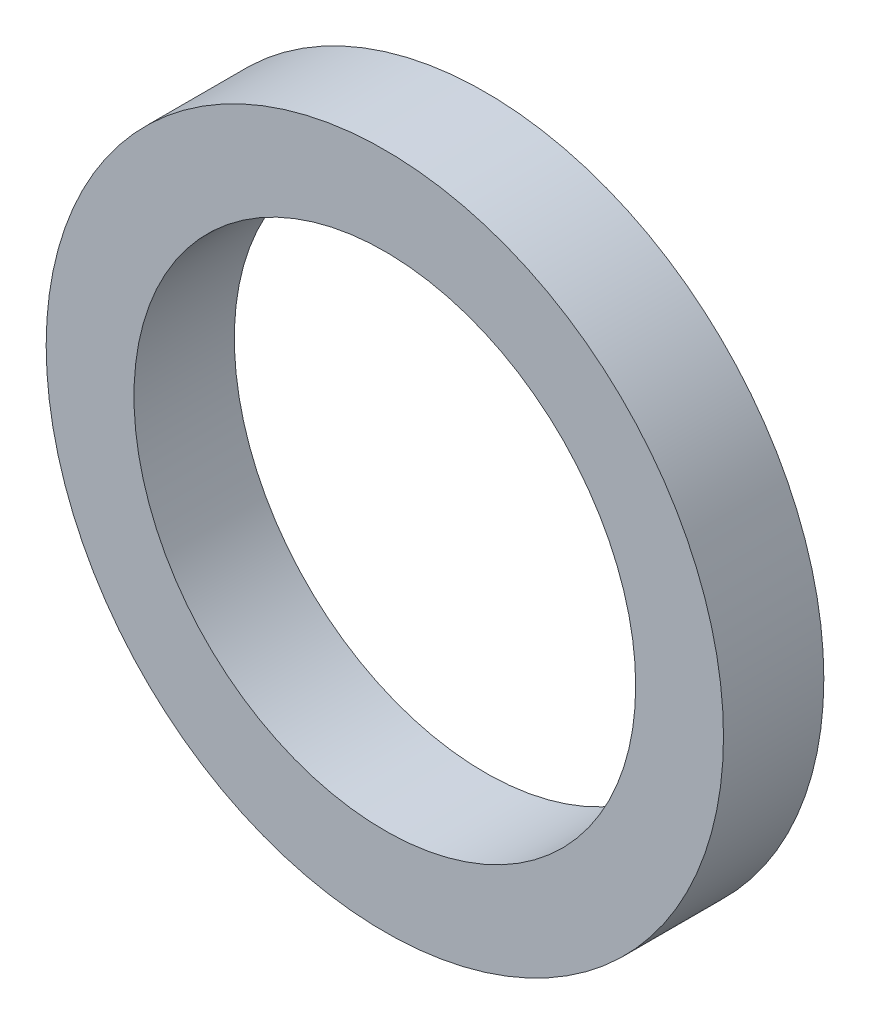
ISO-10303-21;
HEADER;
FILE_DESCRIPTION(('STEP AP214'),'2;1');
FILE_NAME('part.step','',(''),(''),'','','');
FILE_SCHEMA(('AUTOMOTIVE_DESIGN { 1 0 10303 214 1 1 1 1 }'));
ENDSEC;
DATA;
#1=APPLICATION_CONTEXT('core data for automotive mechanical design processes');
#2=APPLICATION_PROTOCOL_DEFINITION('international standard','automotive_design',2000,#1);
#3=PRODUCT_CONTEXT('',#1,'mechanical');
#4=PRODUCT('Part','Part','',(#3));
#5=PRODUCT_RELATED_PRODUCT_CATEGORY('part','',(#4));
#6=PRODUCT_DEFINITION_FORMATION('','',#4);
#7=PRODUCT_DEFINITION_CONTEXT('part definition',#1,'design');
#8=PRODUCT_DEFINITION('design','',#6,#7);
#9=PRODUCT_DEFINITION_SHAPE('','',#8);
#10=(LENGTH_UNIT() NAMED_UNIT(*) SI_UNIT(.MILLI.,.METRE.));
#11=(NAMED_UNIT(*) PLANE_ANGLE_UNIT() SI_UNIT($,.RADIAN.));
#12=(NAMED_UNIT(*) SI_UNIT($,.STERADIAN.) SOLID_ANGLE_UNIT());
#13=UNCERTAINTY_MEASURE_WITH_UNIT(LENGTH_MEASURE(1.E-05),#10,'distance_accuracy_value','');
#14=(GEOMETRIC_REPRESENTATION_CONTEXT(3) GLOBAL_UNCERTAINTY_ASSIGNED_CONTEXT((#13)) GLOBAL_UNIT_ASSIGNED_CONTEXT((#10,
#11,#12)) REPRESENTATION_CONTEXT('',''));
#15=CARTESIAN_POINT('',(0.,0.,0.));
#16=DIRECTION('',(0.,0.,1.));
#17=DIRECTION('',(1.,0.,0.));
#18=AXIS2_PLACEMENT_3D('',#15,#16,#17);
#19=CARTESIAN_POINT('',(0.,0.,4.));
#20=DIRECTION('',(0.,0.,1.));
#21=DIRECTION('',(1.,0.,0.));
#22=AXIS2_PLACEMENT_3D('',#19,#20,#21);
#23=PLANE('',#22);
#24=CARTESIAN_POINT('',(0.,0.,4.));
#25=DIRECTION('',(0.,0.,1.));
#26=DIRECTION('',(1.,0.,0.));
#27=AXIS2_PLACEMENT_3D('',#24,#25,#26);
#28=CIRCLE('',#27,13.5);
#29=CARTESIAN_POINT('',(13.5,0.,4.));
#30=VERTEX_POINT('',#29);
#31=EDGE_CURVE('E10',#30,#30,#28,.T.);
#32=ORIENTED_EDGE('',*,*,#31,.T.);
#33=EDGE_LOOP('',(#32));
#34=FACE_BOUND('',#33,.T.);
#35=CARTESIAN_POINT('',(0.,0.,4.));
#36=DIRECTION('',(0.,0.,1.));
#37=DIRECTION('',(1.,0.,0.));
#38=AXIS2_PLACEMENT_3D('',#35,#36,#37);
#39=CIRCLE('',#38,10.);
#40=CARTESIAN_POINT('',(10.,0.,4.));
#41=VERTEX_POINT('',#40);
#42=EDGE_CURVE('E45',#41,#41,#39,.T.);
#43=ORIENTED_EDGE('',*,*,#42,.F.);
#44=EDGE_LOOP('',(#43));
#45=FACE_BOUND('',#44,.T.);
#46=ADVANCED_FACE('F34',(#34,#45),#23,.T.);
#47=CARTESIAN_POINT('',(0.,0.,0.));
#48=DIRECTION('',(0.,0.,1.));
#49=DIRECTION('',(1.,0.,0.));
#50=AXIS2_PLACEMENT_3D('',#47,#48,#49);
#51=PLANE('',#50);
#52=CARTESIAN_POINT('',(0.,0.,0.));
#53=DIRECTION('',(0.,0.,1.));
#54=DIRECTION('',(1.,0.,0.));
#55=AXIS2_PLACEMENT_3D('',#52,#53,#54);
#56=CIRCLE('',#55,13.5);
#57=CARTESIAN_POINT('',(13.5,0.,0.));
#58=VERTEX_POINT('',#57);
#59=EDGE_CURVE('E38',#58,#58,#56,.T.);
#60=ORIENTED_EDGE('',*,*,#59,.F.);
#61=EDGE_LOOP('',(#60));
#62=FACE_BOUND('',#61,.T.);
#63=CARTESIAN_POINT('',(0.,0.,0.));
#64=DIRECTION('',(0.,0.,1.));
#65=DIRECTION('',(1.,0.,0.));
#66=AXIS2_PLACEMENT_3D('',#63,#64,#65);
#67=CIRCLE('',#66,10.);
#68=CARTESIAN_POINT('',(10.,0.,0.));
#69=VERTEX_POINT('',#68);
#70=EDGE_CURVE('E47',#69,#69,#67,.T.);
#71=ORIENTED_EDGE('',*,*,#70,.T.);
#72=EDGE_LOOP('',(#71));
#73=FACE_BOUND('',#72,.T.);
#74=ADVANCED_FACE('F57',(#62,#73),#51,.F.);
#75=CARTESIAN_POINT('',(0.,0.,4.));
#76=DIRECTION('',(0.,0.,-1.));
#77=DIRECTION('',(-1.,0.,0.));
#78=AXIS2_PLACEMENT_3D('',#75,#76,#77);
#79=CYLINDRICAL_SURFACE('',#78,13.5);
#80=ORIENTED_EDGE('',*,*,#31,.F.);
#81=EDGE_LOOP('',(#80));
#82=FACE_BOUND('',#81,.T.);
#83=ORIENTED_EDGE('',*,*,#59,.T.);
#84=EDGE_LOOP('',(#83));
#85=FACE_BOUND('',#84,.T.);
#86=ADVANCED_FACE('F36',(#82,#85),#79,.T.);
#87=CARTESIAN_POINT('',(0.,0.,4.));
#88=DIRECTION('',(0.,0.,-1.));
#89=DIRECTION('',(-1.,0.,0.));
#90=AXIS2_PLACEMENT_3D('',#87,#88,#89);
#91=CYLINDRICAL_SURFACE('',#90,10.);
#92=ORIENTED_EDGE('',*,*,#42,.T.);
#93=EDGE_LOOP('',(#92));
#94=FACE_BOUND('',#93,.T.);
#95=ORIENTED_EDGE('',*,*,#70,.F.);
#96=EDGE_LOOP('',(#95));
#97=FACE_BOUND('',#96,.T.);
#98=ADVANCED_FACE('F53',(#94,#97),#91,.F.);
#99=CLOSED_SHELL('',(#46,#74,#86,#98));
#100=MANIFOLD_SOLID_BREP('B2',#99);
#101=ADVANCED_BREP_SHAPE_REPRESENTATION('',(#18,#100),#14);
#102=SHAPE_DEFINITION_REPRESENTATION(#9,#101);
ENDSEC;
END-ISO-10303-21;
